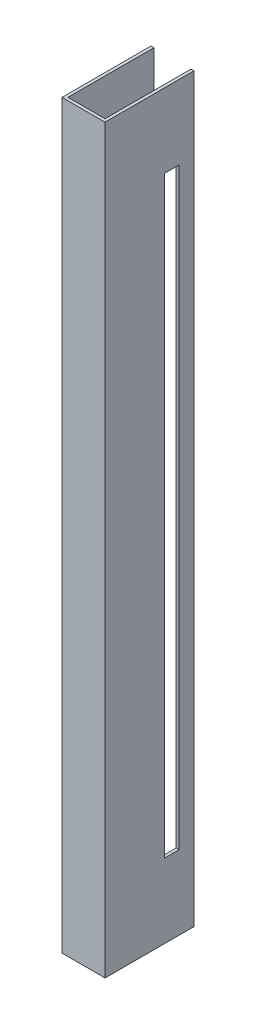
ISO-10303-21;
HEADER;
FILE_DESCRIPTION(('STEP AP214'),'2;1');
FILE_NAME('part.step','',(''),(''),'','','');
FILE_SCHEMA(('AUTOMOTIVE_DESIGN { 1 0 10303 214 1 1 1 1 }'));
ENDSEC;
DATA;
#1=APPLICATION_CONTEXT('core data for automotive mechanical design processes');
#2=APPLICATION_PROTOCOL_DEFINITION('international standard','automotive_design',2000,#1);
#3=PRODUCT_CONTEXT('',#1,'mechanical');
#4=PRODUCT('Part','Part','',(#3));
#5=PRODUCT_RELATED_PRODUCT_CATEGORY('part','',(#4));
#6=PRODUCT_DEFINITION_FORMATION('','',#4);
#7=PRODUCT_DEFINITION_CONTEXT('part definition',#1,'design');
#8=PRODUCT_DEFINITION('design','',#6,#7);
#9=PRODUCT_DEFINITION_SHAPE('','',#8);
#10=(LENGTH_UNIT() NAMED_UNIT(*) SI_UNIT(.MILLI.,.METRE.));
#11=(NAMED_UNIT(*) PLANE_ANGLE_UNIT() SI_UNIT($,.RADIAN.));
#12=(NAMED_UNIT(*) SI_UNIT($,.STERADIAN.) SOLID_ANGLE_UNIT());
#13=UNCERTAINTY_MEASURE_WITH_UNIT(LENGTH_MEASURE(1.E-05),#10,'distance_accuracy_value','');
#14=(GEOMETRIC_REPRESENTATION_CONTEXT(3) GLOBAL_UNCERTAINTY_ASSIGNED_CONTEXT((#13)) GLOBAL_UNIT_ASSIGNED_CONTEXT((#10,
#11,#12)) REPRESENTATION_CONTEXT('',''));
#15=CARTESIAN_POINT('',(0.,0.,0.));
#16=DIRECTION('',(0.,0.,1.));
#17=DIRECTION('',(1.,0.,0.));
#18=AXIS2_PLACEMENT_3D('',#15,#16,#17);
#19=CARTESIAN_POINT('',(-25.,500.,-25.));
#20=DIRECTION('',(0.,0.,1.));
#21=DIRECTION('',(1.,0.,0.));
#22=AXIS2_PLACEMENT_3D('',#19,#20,#21);
#23=PLANE('',#22);
#24=DIRECTION('',(-1.,0.,0.));
#25=VECTOR('',#24,1.);
#26=CARTESIAN_POINT('',(-25.,0.,-25.));
#27=LINE('',#26,#25);
#28=CARTESIAN_POINT('',(-25.,0.,-25.));
#29=VERTEX_POINT('',#28);
#30=CARTESIAN_POINT('',(-27.,0.,-25.));
#31=VERTEX_POINT('',#30);
#32=EDGE_CURVE('E226',#29,#31,#27,.T.);
#33=ORIENTED_EDGE('',*,*,#32,.T.);
#34=DIRECTION('',(0.,-1.,0.));
#35=VECTOR('',#34,1.);
#36=CARTESIAN_POINT('',(-27.,500.,-25.));
#37=LINE('',#36,#35);
#38=CARTESIAN_POINT('',(-27.,500.,-25.));
#39=VERTEX_POINT('',#38);
#40=EDGE_CURVE('E304',#39,#31,#37,.T.);
#41=ORIENTED_EDGE('',*,*,#40,.F.);
#42=DIRECTION('',(-1.,0.,0.));
#43=VECTOR('',#42,1.);
#44=CARTESIAN_POINT('',(-25.,500.,-25.));
#45=LINE('',#44,#43);
#46=CARTESIAN_POINT('',(-25.,500.,-25.));
#47=VERTEX_POINT('',#46);
#48=EDGE_CURVE('E227',#47,#39,#45,.T.);
#49=ORIENTED_EDGE('',*,*,#48,.F.);
#50=DIRECTION('',(0.,-1.,0.));
#51=VECTOR('',#50,1.);
#52=CARTESIAN_POINT('',(-25.,500.,-25.));
#53=LINE('',#52,#51);
#54=EDGE_CURVE('E253',#47,#29,#53,.T.);
#55=ORIENTED_EDGE('',*,*,#54,.T.);
#56=EDGE_LOOP('',(#33,#41,#49,#55));
#57=FACE_BOUND('',#56,.T.);
#58=ADVANCED_FACE('F39',(#57),#23,.F.);
#59=CARTESIAN_POINT('',(-27.,500.,35.));
#60=DIRECTION('',(1.,0.,0.));
#61=DIRECTION('',(0.,0.,-1.));
#62=AXIS2_PLACEMENT_3D('',#59,#60,#61);
#63=PLANE('',#62);
#64=DIRECTION('',(0.,0.,-1.));
#65=VECTOR('',#64,1.);
#66=CARTESIAN_POINT('',(-27.,50.,-5.00000000000003));
#67=LINE('',#66,#65);
#68=CARTESIAN_POINT('',(-27.,50.,-5.00000000000003));
#69=VERTEX_POINT('',#68);
#70=CARTESIAN_POINT('',(-27.,50.,-15.));
#71=VERTEX_POINT('',#70);
#72=EDGE_CURVE('E175',#69,#71,#67,.T.);
#73=ORIENTED_EDGE('',*,*,#72,.T.);
#74=DIRECTION('',(0.,1.,0.));
#75=VECTOR('',#74,1.);
#76=CARTESIAN_POINT('',(-27.,450.,-15.));
#77=LINE('',#76,#75);
#78=CARTESIAN_POINT('',(-27.,450.,-15.));
#79=VERTEX_POINT('',#78);
#80=EDGE_CURVE('E158',#71,#79,#77,.T.);
#81=ORIENTED_EDGE('',*,*,#80,.T.);
#82=DIRECTION('',(0.,0.,1.));
#83=VECTOR('',#82,1.);
#84=CARTESIAN_POINT('',(-27.,450.,-4.99999999999998));
#85=LINE('',#84,#83);
#86=CARTESIAN_POINT('',(-27.,450.,-4.99999999999998));
#87=VERTEX_POINT('',#86);
#88=EDGE_CURVE('E166',#79,#87,#85,.T.);
#89=ORIENTED_EDGE('',*,*,#88,.T.);
#90=DIRECTION('',(0.,-1.,0.));
#91=VECTOR('',#90,1.);
#92=CARTESIAN_POINT('',(-27.,450.,-4.99999999999998));
#93=LINE('',#92,#91);
#94=EDGE_CURVE('E54',#87,#69,#93,.T.);
#95=ORIENTED_EDGE('',*,*,#94,.T.);
#96=EDGE_LOOP('',(#73,#81,#89,#95));
#97=FACE_BOUND('',#96,.T.);
#98=DIRECTION('',(0.,0.,1.));
#99=VECTOR('',#98,1.);
#100=CARTESIAN_POINT('',(-27.,0.,35.));
#101=LINE('',#100,#99);
#102=CARTESIAN_POINT('',(-27.,0.,35.));
#103=VERTEX_POINT('',#102);
#104=EDGE_CURVE('E257',#31,#103,#101,.T.);
#105=ORIENTED_EDGE('',*,*,#104,.T.);
#106=DIRECTION('',(0.,-1.,0.));
#107=VECTOR('',#106,1.);
#108=CARTESIAN_POINT('',(-27.,500.,35.));
#109=LINE('',#108,#107);
#110=CARTESIAN_POINT('',(-27.,500.,35.));
#111=VERTEX_POINT('',#110);
#112=EDGE_CURVE('E300',#111,#103,#109,.T.);
#113=ORIENTED_EDGE('',*,*,#112,.F.);
#114=DIRECTION('',(0.,0.,1.));
#115=VECTOR('',#114,1.);
#116=CARTESIAN_POINT('',(-27.,500.,35.));
#117=LINE('',#116,#115);
#118=EDGE_CURVE('E231',#39,#111,#117,.T.);
#119=ORIENTED_EDGE('',*,*,#118,.F.);
#120=ORIENTED_EDGE('',*,*,#40,.T.);
#121=EDGE_LOOP('',(#105,#113,#119,#120));
#122=FACE_BOUND('',#121,.T.);
#123=ADVANCED_FACE('F172',(#97,#122),#63,.F.);
#124=CARTESIAN_POINT('',(2.00000000000001,500.,35.));
#125=DIRECTION('',(0.,0.,-1.));
#126=DIRECTION('',(-1.,0.,0.));
#127=AXIS2_PLACEMENT_3D('',#124,#125,#126);
#128=PLANE('',#127);
#129=DIRECTION('',(1.,0.,0.));
#130=VECTOR('',#129,1.);
#131=CARTESIAN_POINT('',(2.00000000000001,0.,35.));
#132=LINE('',#131,#130);
#133=CARTESIAN_POINT('',(2.00000000000001,0.,35.));
#134=VERTEX_POINT('',#133);
#135=EDGE_CURVE('E260',#103,#134,#132,.T.);
#136=ORIENTED_EDGE('',*,*,#135,.T.);
#137=DIRECTION('',(0.,-1.,0.));
#138=VECTOR('',#137,1.);
#139=CARTESIAN_POINT('',(2.00000000000001,500.,35.));
#140=LINE('',#139,#138);
#141=CARTESIAN_POINT('',(2.00000000000001,500.,35.));
#142=VERTEX_POINT('',#141);
#143=EDGE_CURVE('E296',#142,#134,#140,.T.);
#144=ORIENTED_EDGE('',*,*,#143,.F.);
#145=DIRECTION('',(1.,0.,0.));
#146=VECTOR('',#145,1.);
#147=CARTESIAN_POINT('',(2.00000000000001,500.,35.));
#148=LINE('',#147,#146);
#149=EDGE_CURVE('E235',#111,#142,#148,.T.);
#150=ORIENTED_EDGE('',*,*,#149,.F.);
#151=ORIENTED_EDGE('',*,*,#112,.T.);
#152=EDGE_LOOP('',(#136,#144,#150,#151));
#153=FACE_BOUND('',#152,.T.);
#154=ADVANCED_FACE('F341',(#153),#128,.F.);
#155=CARTESIAN_POINT('',(2.00000000000001,500.,35.));
#156=DIRECTION('',(-1.,0.,0.));
#157=DIRECTION('',(0.,0.,1.));
#158=AXIS2_PLACEMENT_3D('',#155,#156,#157);
#159=PLANE('',#158);
#160=DIRECTION('',(0.,0.,-1.));
#161=VECTOR('',#160,1.);
#162=CARTESIAN_POINT('',(2.00000000000001,450.,35.0000000000003));
#163=LINE('',#162,#161);
#164=CARTESIAN_POINT('',(2.,450.,-4.99999999999998));
#165=VERTEX_POINT('',#164);
#166=CARTESIAN_POINT('',(2.00000000000001,450.,-15.));
#167=VERTEX_POINT('',#166);
#168=EDGE_CURVE('E198',#165,#167,#163,.T.);
#169=ORIENTED_EDGE('',*,*,#168,.T.);
#170=DIRECTION('',(0.,-1.,0.));
#171=VECTOR('',#170,1.);
#172=CARTESIAN_POINT('',(2.00000000000001,500.,-15.));
#173=LINE('',#172,#171);
#174=CARTESIAN_POINT('',(2.,50.,-15.));
#175=VERTEX_POINT('',#174);
#176=EDGE_CURVE('E222',#167,#175,#173,.T.);
#177=ORIENTED_EDGE('',*,*,#176,.T.);
#178=DIRECTION('',(0.,0.,1.));
#179=VECTOR('',#178,1.);
#180=CARTESIAN_POINT('',(2.00000000000001,50.,35.));
#181=LINE('',#180,#179);
#182=CARTESIAN_POINT('',(2.,50.,-5.00000000000003));
#183=VERTEX_POINT('',#182);
#184=EDGE_CURVE('E214',#175,#183,#181,.T.);
#185=ORIENTED_EDGE('',*,*,#184,.T.);
#186=DIRECTION('',(0.,1.,0.));
#187=VECTOR('',#186,1.);
#188=CARTESIAN_POINT('',(2.00000000000001,500.,-4.99999999999998));
#189=LINE('',#188,#187);
#190=EDGE_CURVE('E206',#183,#165,#189,.T.);
#191=ORIENTED_EDGE('',*,*,#190,.T.);
#192=EDGE_LOOP('',(#169,#177,#185,#191));
#193=FACE_BOUND('',#192,.T.);
#194=DIRECTION('',(0.,0.,-1.));
#195=VECTOR('',#194,1.);
#196=CARTESIAN_POINT('',(2.00000000000001,0.,35.));
#197=LINE('',#196,#195);
#198=CARTESIAN_POINT('',(2.00000000000001,0.,-25.));
#199=VERTEX_POINT('',#198);
#200=EDGE_CURVE('E263',#134,#199,#197,.T.);
#201=ORIENTED_EDGE('',*,*,#200,.T.);
#202=DIRECTION('',(0.,-1.,0.));
#203=VECTOR('',#202,1.);
#204=CARTESIAN_POINT('',(2.00000000000001,500.,-25.));
#205=LINE('',#204,#203);
#206=CARTESIAN_POINT('',(2.00000000000001,500.,-25.));
#207=VERTEX_POINT('',#206);
#208=EDGE_CURVE('E292',#207,#199,#205,.T.);
#209=ORIENTED_EDGE('',*,*,#208,.F.);
#210=DIRECTION('',(0.,0.,-1.));
#211=VECTOR('',#210,1.);
#212=CARTESIAN_POINT('',(2.00000000000001,500.,35.));
#213=LINE('',#212,#211);
#214=EDGE_CURVE('E238',#142,#207,#213,.T.);
#215=ORIENTED_EDGE('',*,*,#214,.F.);
#216=ORIENTED_EDGE('',*,*,#143,.T.);
#217=EDGE_LOOP('',(#201,#209,#215,#216));
#218=FACE_BOUND('',#217,.T.);
#219=ADVANCED_FACE('F373',(#193,#218),#159,.F.);
#220=CARTESIAN_POINT('',(2.00000000000001,500.,-25.));
#221=DIRECTION('',(0.,0.,1.));
#222=DIRECTION('',(1.,0.,0.));
#223=AXIS2_PLACEMENT_3D('',#220,#221,#222);
#224=PLANE('',#223);
#225=DIRECTION('',(-1.,0.,0.));
#226=VECTOR('',#225,1.);
#227=CARTESIAN_POINT('',(2.00000000000001,0.,-25.));
#228=LINE('',#227,#226);
#229=CARTESIAN_POINT('',(0.,0.,-25.));
#230=VERTEX_POINT('',#229);
#231=EDGE_CURVE('E266',#199,#230,#228,.T.);
#232=ORIENTED_EDGE('',*,*,#231,.T.);
#233=DIRECTION('',(0.,-1.,0.));
#234=VECTOR('',#233,1.);
#235=CARTESIAN_POINT('',(0.,500.,-25.));
#236=LINE('',#235,#234);
#237=CARTESIAN_POINT('',(0.,500.,-25.));
#238=VERTEX_POINT('',#237);
#239=EDGE_CURVE('E288',#238,#230,#236,.T.);
#240=ORIENTED_EDGE('',*,*,#239,.F.);
#241=DIRECTION('',(-1.,0.,0.));
#242=VECTOR('',#241,1.);
#243=CARTESIAN_POINT('',(2.00000000000001,500.,-25.));
#244=LINE('',#243,#242);
#245=EDGE_CURVE('E241',#207,#238,#244,.T.);
#246=ORIENTED_EDGE('',*,*,#245,.F.);
#247=ORIENTED_EDGE('',*,*,#208,.T.);
#248=EDGE_LOOP('',(#232,#240,#246,#247));
#249=FACE_BOUND('',#248,.T.);
#250=ADVANCED_FACE('F369',(#249),#224,.F.);
#251=CARTESIAN_POINT('',(0.,500.,33.));
#252=DIRECTION('',(1.,0.,0.));
#253=DIRECTION('',(0.,0.,-1.));
#254=AXIS2_PLACEMENT_3D('',#251,#252,#253);
#255=PLANE('',#254);
#256=DIRECTION('',(0.,0.,-1.));
#257=VECTOR('',#256,1.);
#258=CARTESIAN_POINT('',(0.,50.,33.));
#259=LINE('',#258,#257);
#260=CARTESIAN_POINT('',(0.,50.,-5.00000000000003));
#261=VERTEX_POINT('',#260);
#262=CARTESIAN_POINT('',(0.,50.,-15.));
#263=VERTEX_POINT('',#262);
#264=EDGE_CURVE('E210',#261,#263,#259,.T.);
#265=ORIENTED_EDGE('',*,*,#264,.T.);
#266=DIRECTION('',(0.,1.,0.));
#267=VECTOR('',#266,1.);
#268=CARTESIAN_POINT('',(0.,500.,-15.));
#269=LINE('',#268,#267);
#270=CARTESIAN_POINT('',(0.,450.,-15.));
#271=VERTEX_POINT('',#270);
#272=EDGE_CURVE('E218',#263,#271,#269,.T.);
#273=ORIENTED_EDGE('',*,*,#272,.T.);
#274=DIRECTION('',(0.,0.,1.));
#275=VECTOR('',#274,1.);
#276=CARTESIAN_POINT('',(0.,450.,33.0000000000003));
#277=LINE('',#276,#275);
#278=CARTESIAN_POINT('',(0.,450.,-4.99999999999998));
#279=VERTEX_POINT('',#278);
#280=EDGE_CURVE('E186',#271,#279,#277,.T.);
#281=ORIENTED_EDGE('',*,*,#280,.T.);
#282=DIRECTION('',(0.,-1.,0.));
#283=VECTOR('',#282,1.);
#284=CARTESIAN_POINT('',(0.,500.,-4.99999999999998));
#285=LINE('',#284,#283);
#286=EDGE_CURVE('E202',#279,#261,#285,.T.);
#287=ORIENTED_EDGE('',*,*,#286,.T.);
#288=EDGE_LOOP('',(#265,#273,#281,#287));
#289=FACE_BOUND('',#288,.T.);
#290=DIRECTION('',(0.,0.,1.));
#291=VECTOR('',#290,1.);
#292=CARTESIAN_POINT('',(0.,0.,33.));
#293=LINE('',#292,#291);
#294=CARTESIAN_POINT('',(0.,0.,33.));
#295=VERTEX_POINT('',#294);
#296=EDGE_CURVE('E269',#230,#295,#293,.T.);
#297=ORIENTED_EDGE('',*,*,#296,.T.);
#298=DIRECTION('',(0.,-1.,0.));
#299=VECTOR('',#298,1.);
#300=CARTESIAN_POINT('',(0.,500.,33.));
#301=LINE('',#300,#299);
#302=CARTESIAN_POINT('',(0.,500.,33.));
#303=VERTEX_POINT('',#302);
#304=EDGE_CURVE('E284',#303,#295,#301,.T.);
#305=ORIENTED_EDGE('',*,*,#304,.F.);
#306=DIRECTION('',(0.,0.,1.));
#307=VECTOR('',#306,1.);
#308=CARTESIAN_POINT('',(0.,500.,33.));
#309=LINE('',#308,#307);
#310=EDGE_CURVE('E244',#238,#303,#309,.T.);
#311=ORIENTED_EDGE('',*,*,#310,.F.);
#312=ORIENTED_EDGE('',*,*,#239,.T.);
#313=EDGE_LOOP('',(#297,#305,#311,#312));
#314=FACE_BOUND('',#313,.T.);
#315=ADVANCED_FACE('F364',(#289,#314),#255,.F.);
#316=CARTESIAN_POINT('',(0.,500.,33.));
#317=DIRECTION('',(0.,0.,1.));
#318=DIRECTION('',(1.,0.,0.));
#319=AXIS2_PLACEMENT_3D('',#316,#317,#318);
#320=PLANE('',#319);
#321=DIRECTION('',(-1.,0.,0.));
#322=VECTOR('',#321,1.);
#323=CARTESIAN_POINT('',(0.,0.,33.));
#324=LINE('',#323,#322);
#325=CARTESIAN_POINT('',(-25.,0.,33.));
#326=VERTEX_POINT('',#325);
#327=EDGE_CURVE('E272',#295,#326,#324,.T.);
#328=ORIENTED_EDGE('',*,*,#327,.T.);
#329=DIRECTION('',(0.,-1.,0.));
#330=VECTOR('',#329,1.);
#331=CARTESIAN_POINT('',(-25.,500.,33.));
#332=LINE('',#331,#330);
#333=CARTESIAN_POINT('',(-25.,500.,33.));
#334=VERTEX_POINT('',#333);
#335=EDGE_CURVE('E280',#334,#326,#332,.T.);
#336=ORIENTED_EDGE('',*,*,#335,.F.);
#337=DIRECTION('',(-1.,0.,0.));
#338=VECTOR('',#337,1.);
#339=CARTESIAN_POINT('',(0.,500.,33.));
#340=LINE('',#339,#338);
#341=EDGE_CURVE('E247',#303,#334,#340,.T.);
#342=ORIENTED_EDGE('',*,*,#341,.F.);
#343=ORIENTED_EDGE('',*,*,#304,.T.);
#344=EDGE_LOOP('',(#328,#336,#342,#343));
#345=FACE_BOUND('',#344,.T.);
#346=ADVANCED_FACE('F359',(#345),#320,.F.);
#347=CARTESIAN_POINT('',(-25.,500.,33.));
#348=DIRECTION('',(-1.,0.,0.));
#349=DIRECTION('',(0.,0.,1.));
#350=AXIS2_PLACEMENT_3D('',#347,#348,#349);
#351=PLANE('',#350);
#352=DIRECTION('',(0.,0.,-1.));
#353=VECTOR('',#352,1.);
#354=CARTESIAN_POINT('',(-25.,450.,33.0000000000003));
#355=LINE('',#354,#353);
#356=CARTESIAN_POINT('',(-25.,450.,-4.99999999999998));
#357=VERTEX_POINT('',#356);
#358=CARTESIAN_POINT('',(-25.,450.,-15.));
#359=VERTEX_POINT('',#358);
#360=EDGE_CURVE('E308',#357,#359,#355,.T.);
#361=ORIENTED_EDGE('',*,*,#360,.T.);
#362=DIRECTION('',(0.,-1.,0.));
#363=VECTOR('',#362,1.);
#364=CARTESIAN_POINT('',(-25.,500.,-15.));
#365=LINE('',#364,#363);
#366=CARTESIAN_POINT('',(-25.,50.,-15.));
#367=VERTEX_POINT('',#366);
#368=EDGE_CURVE('E11',#359,#367,#365,.T.);
#369=ORIENTED_EDGE('',*,*,#368,.T.);
#370=DIRECTION('',(0.,0.,1.));
#371=VECTOR('',#370,1.);
#372=CARTESIAN_POINT('',(-25.,50.,33.));
#373=LINE('',#372,#371);
#374=CARTESIAN_POINT('',(-25.,50.,-5.00000000000003));
#375=VERTEX_POINT('',#374);
#376=EDGE_CURVE('E47',#367,#375,#373,.T.);
#377=ORIENTED_EDGE('',*,*,#376,.T.);
#378=DIRECTION('',(0.,1.,0.));
#379=VECTOR('',#378,1.);
#380=CARTESIAN_POINT('',(-25.,500.,-4.99999999999998));
#381=LINE('',#380,#379);
#382=EDGE_CURVE('E311',#375,#357,#381,.T.);
#383=ORIENTED_EDGE('',*,*,#382,.T.);
#384=EDGE_LOOP('',(#361,#369,#377,#383));
#385=FACE_BOUND('',#384,.T.);
#386=DIRECTION('',(0.,0.,-1.));
#387=VECTOR('',#386,1.);
#388=CARTESIAN_POINT('',(-25.,0.,33.));
#389=LINE('',#388,#387);
#390=EDGE_CURVE('E232',#326,#29,#389,.T.);
#391=ORIENTED_EDGE('',*,*,#390,.T.);
#392=ORIENTED_EDGE('',*,*,#54,.F.);
#393=DIRECTION('',(0.,0.,-1.));
#394=VECTOR('',#393,1.);
#395=CARTESIAN_POINT('',(-25.,500.,33.));
#396=LINE('',#395,#394);
#397=EDGE_CURVE('E250',#334,#47,#396,.T.);
#398=ORIENTED_EDGE('',*,*,#397,.F.);
#399=ORIENTED_EDGE('',*,*,#335,.T.);
#400=EDGE_LOOP('',(#391,#392,#398,#399));
#401=FACE_BOUND('',#400,.T.);
#402=ADVANCED_FACE('F317',(#385,#401),#351,.F.);
#403=CARTESIAN_POINT('',(0.,500.,0.));
#404=DIRECTION('',(0.,-1.,0.));
#405=DIRECTION('',(0.,0.,-1.));
#406=AXIS2_PLACEMENT_3D('',#403,#404,#405);
#407=PLANE('',#406);
#408=ORIENTED_EDGE('',*,*,#48,.T.);
#409=ORIENTED_EDGE('',*,*,#118,.T.);
#410=ORIENTED_EDGE('',*,*,#149,.T.);
#411=ORIENTED_EDGE('',*,*,#214,.T.);
#412=ORIENTED_EDGE('',*,*,#245,.T.);
#413=ORIENTED_EDGE('',*,*,#310,.T.);
#414=ORIENTED_EDGE('',*,*,#341,.T.);
#415=ORIENTED_EDGE('',*,*,#397,.T.);
#416=EDGE_LOOP('',(#408,#409,#410,#411,#412,#413,#414,#415));
#417=FACE_BOUND('',#416,.T.);
#418=ADVANCED_FACE('F354',(#417),#407,.F.);
#419=CARTESIAN_POINT('',(0.,0.,0.));
#420=DIRECTION('',(0.,-1.,0.));
#421=DIRECTION('',(0.,0.,-1.));
#422=AXIS2_PLACEMENT_3D('',#419,#420,#421);
#423=PLANE('',#422);
#424=ORIENTED_EDGE('',*,*,#32,.F.);
#425=ORIENTED_EDGE('',*,*,#390,.F.);
#426=ORIENTED_EDGE('',*,*,#327,.F.);
#427=ORIENTED_EDGE('',*,*,#296,.F.);
#428=ORIENTED_EDGE('',*,*,#231,.F.);
#429=ORIENTED_EDGE('',*,*,#200,.F.);
#430=ORIENTED_EDGE('',*,*,#135,.F.);
#431=ORIENTED_EDGE('',*,*,#104,.F.);
#432=EDGE_LOOP('',(#424,#425,#426,#427,#428,#429,#430,#431));
#433=FACE_BOUND('',#432,.T.);
#434=ADVANCED_FACE('F331',(#433),#423,.T.);
#435=CARTESIAN_POINT('',(-27.,450.,-4.99999999999998));
#436=DIRECTION('',(0.,1.,0.));
#437=DIRECTION('',(0.,0.,1.));
#438=AXIS2_PLACEMENT_3D('',#435,#436,#437);
#439=PLANE('',#438);
#440=DIRECTION('',(1.,0.,0.));
#441=VECTOR('',#440,1.);
#442=CARTESIAN_POINT('',(-27.,450.,-4.99999999999998));
#443=LINE('',#442,#441);
#444=EDGE_CURVE('E168',#87,#357,#443,.T.);
#445=ORIENTED_EDGE('',*,*,#444,.F.);
#446=ORIENTED_EDGE('',*,*,#88,.F.);
#447=DIRECTION('',(1.,0.,0.));
#448=VECTOR('',#447,1.);
#449=CARTESIAN_POINT('',(-27.,450.,-15.));
#450=LINE('',#449,#448);
#451=EDGE_CURVE('E153',#79,#359,#450,.T.);
#452=ORIENTED_EDGE('',*,*,#451,.T.);
#453=ORIENTED_EDGE('',*,*,#360,.F.);
#454=EDGE_LOOP('',(#445,#446,#452,#453));
#455=FACE_BOUND('',#454,.T.);
#456=ADVANCED_FACE('F167',(#455),#439,.F.);
#457=CARTESIAN_POINT('',(-27.,450.,-4.99999999999998));
#458=DIRECTION('',(0.,0.,1.));
#459=DIRECTION('',(0.,-1.,0.));
#460=AXIS2_PLACEMENT_3D('',#457,#458,#459);
#461=PLANE('',#460);
#462=DIRECTION('',(1.,0.,0.));
#463=VECTOR('',#462,1.);
#464=CARTESIAN_POINT('',(-27.,50.,-5.00000000000003));
#465=LINE('',#464,#463);
#466=EDGE_CURVE('E188',#69,#375,#465,.T.);
#467=ORIENTED_EDGE('',*,*,#466,.F.);
#468=ORIENTED_EDGE('',*,*,#94,.F.);
#469=ORIENTED_EDGE('',*,*,#444,.T.);
#470=ORIENTED_EDGE('',*,*,#382,.F.);
#471=EDGE_LOOP('',(#467,#468,#469,#470));
#472=FACE_BOUND('',#471,.T.);
#473=ADVANCED_FACE('F321',(#472),#461,.F.);
#474=CARTESIAN_POINT('',(-27.,50.,-5.00000000000003));
#475=DIRECTION('',(0.,-1.,0.));
#476=DIRECTION('',(0.,0.,-1.));
#477=AXIS2_PLACEMENT_3D('',#474,#475,#476);
#478=PLANE('',#477);
#479=DIRECTION('',(1.,0.,0.));
#480=VECTOR('',#479,1.);
#481=CARTESIAN_POINT('',(-27.,50.,-15.));
#482=LINE('',#481,#480);
#483=EDGE_CURVE('E183',#71,#367,#482,.T.);
#484=ORIENTED_EDGE('',*,*,#483,.F.);
#485=ORIENTED_EDGE('',*,*,#72,.F.);
#486=ORIENTED_EDGE('',*,*,#466,.T.);
#487=ORIENTED_EDGE('',*,*,#376,.F.);
#488=EDGE_LOOP('',(#484,#485,#486,#487));
#489=FACE_BOUND('',#488,.T.);
#490=ADVANCED_FACE('F320',(#489),#478,.F.);
#491=CARTESIAN_POINT('',(-27.,450.,-15.));
#492=DIRECTION('',(0.,0.,-1.));
#493=DIRECTION('',(0.,1.,0.));
#494=AXIS2_PLACEMENT_3D('',#491,#492,#493);
#495=PLANE('',#494);
#496=ORIENTED_EDGE('',*,*,#451,.F.);
#497=ORIENTED_EDGE('',*,*,#80,.F.);
#498=ORIENTED_EDGE('',*,*,#483,.T.);
#499=ORIENTED_EDGE('',*,*,#368,.F.);
#500=EDGE_LOOP('',(#496,#497,#498,#499));
#501=FACE_BOUND('',#500,.T.);
#502=ADVANCED_FACE('F155',(#501),#495,.F.);
#503=EDGE_CURVE('E62',#271,#167,#450,.T.);
#504=ORIENTED_EDGE('',*,*,#503,.F.);
#505=ORIENTED_EDGE('',*,*,#272,.F.);
#506=EDGE_CURVE('E187',#263,#175,#482,.T.);
#507=ORIENTED_EDGE('',*,*,#506,.T.);
#508=ORIENTED_EDGE('',*,*,#176,.F.);
#509=EDGE_LOOP('',(#504,#505,#507,#508));
#510=FACE_BOUND('',#509,.T.);
#511=ADVANCED_FACE('F397',(#510),#495,.F.);
#512=ORIENTED_EDGE('',*,*,#506,.F.);
#513=ORIENTED_EDGE('',*,*,#264,.F.);
#514=EDGE_CURVE('E192',#261,#183,#465,.T.);
#515=ORIENTED_EDGE('',*,*,#514,.T.);
#516=ORIENTED_EDGE('',*,*,#184,.F.);
#517=EDGE_LOOP('',(#512,#513,#515,#516));
#518=FACE_BOUND('',#517,.T.);
#519=ADVANCED_FACE('F330',(#518),#478,.F.);
#520=ORIENTED_EDGE('',*,*,#514,.F.);
#521=ORIENTED_EDGE('',*,*,#286,.F.);
#522=EDGE_CURVE('E163',#279,#165,#443,.T.);
#523=ORIENTED_EDGE('',*,*,#522,.T.);
#524=ORIENTED_EDGE('',*,*,#190,.F.);
#525=EDGE_LOOP('',(#520,#521,#523,#524));
#526=FACE_BOUND('',#525,.T.);
#527=ADVANCED_FACE('F324',(#526),#461,.F.);
#528=ORIENTED_EDGE('',*,*,#522,.F.);
#529=ORIENTED_EDGE('',*,*,#280,.F.);
#530=ORIENTED_EDGE('',*,*,#503,.T.);
#531=ORIENTED_EDGE('',*,*,#168,.F.);
#532=EDGE_LOOP('',(#528,#529,#530,#531));
#533=FACE_BOUND('',#532,.T.);
#534=ADVANCED_FACE('F333',(#533),#439,.F.);
#535=CLOSED_SHELL('',(#58,#123,#154,#219,#250,#315,#346,#402,#418,#434,#456,#473,#490,#502,#511,
#519,#527,#534));
#536=MANIFOLD_SOLID_BREP('B2',#535);
#537=ADVANCED_BREP_SHAPE_REPRESENTATION('',(#18,#536),#14);
#538=SHAPE_DEFINITION_REPRESENTATION(#9,#537);
ENDSEC;
END-ISO-10303-21;
